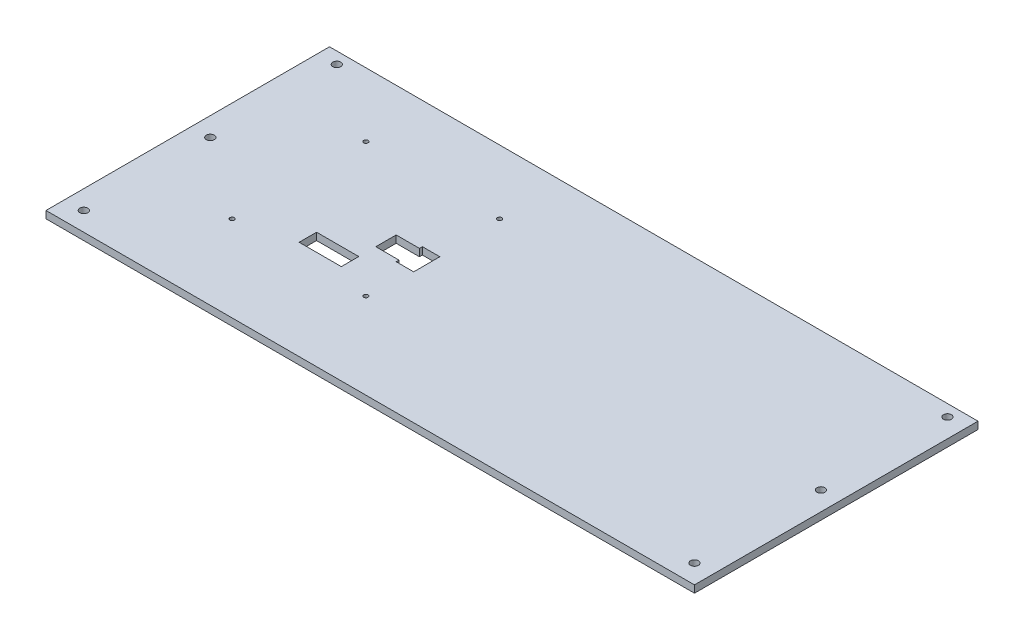
ISO-10303-21;
HEADER;
FILE_DESCRIPTION(('STEP AP214'),'2;1');
FILE_NAME('part.step','',(''),(''),'','','');
FILE_SCHEMA(('AUTOMOTIVE_DESIGN { 1 0 10303 214 1 1 1 1 }'));
ENDSEC;
DATA;
#1=APPLICATION_CONTEXT('core data for automotive mechanical design processes');
#2=APPLICATION_PROTOCOL_DEFINITION('international standard','automotive_design',2000,#1);
#3=PRODUCT_CONTEXT('',#1,'mechanical');
#4=PRODUCT('Part','Part','',(#3));
#5=PRODUCT_RELATED_PRODUCT_CATEGORY('part','',(#4));
#6=PRODUCT_DEFINITION_FORMATION('','',#4);
#7=PRODUCT_DEFINITION_CONTEXT('part definition',#1,'design');
#8=PRODUCT_DEFINITION('design','',#6,#7);
#9=PRODUCT_DEFINITION_SHAPE('','',#8);
#10=(LENGTH_UNIT() NAMED_UNIT(*) SI_UNIT(.MILLI.,.METRE.));
#11=(NAMED_UNIT(*) PLANE_ANGLE_UNIT() SI_UNIT($,.RADIAN.));
#12=(NAMED_UNIT(*) SI_UNIT($,.STERADIAN.) SOLID_ANGLE_UNIT());
#13=UNCERTAINTY_MEASURE_WITH_UNIT(LENGTH_MEASURE(1.E-05),#10,'distance_accuracy_value','');
#14=(GEOMETRIC_REPRESENTATION_CONTEXT(3) GLOBAL_UNCERTAINTY_ASSIGNED_CONTEXT((#13)) GLOBAL_UNIT_ASSIGNED_CONTEXT((#10,
#11,#12)) REPRESENTATION_CONTEXT('',''));
#15=CARTESIAN_POINT('',(0.,0.,0.));
#16=DIRECTION('',(0.,0.,1.));
#17=DIRECTION('',(1.,0.,0.));
#18=AXIS2_PLACEMENT_3D('',#15,#16,#17);
#19=CARTESIAN_POINT('',(0.,5.,0.));
#20=DIRECTION('',(0.,-1.,0.));
#21=DIRECTION('',(0.,0.,-1.));
#22=AXIS2_PLACEMENT_3D('',#19,#20,#21);
#23=PLANE('',#22);
#24=CARTESIAN_POINT('',(210.,5.,84.5));
#25=DIRECTION('',(0.,-1.,0.));
#26=DIRECTION('',(0.,0.,-1.));
#27=AXIS2_PLACEMENT_3D('',#24,#25,#26);
#28=CIRCLE('',#27,2.75);
#29=CARTESIAN_POINT('',(210.,5.,81.75));
#30=VERTEX_POINT('',#29);
#31=EDGE_CURVE('E578',#30,#30,#28,.T.);
#32=ORIENTED_EDGE('',*,*,#31,.T.);
#33=EDGE_LOOP('',(#32));
#34=FACE_BOUND('',#33,.T.);
#35=CARTESIAN_POINT('',(210.,5.,-2.5));
#36=DIRECTION('',(0.,-1.,0.));
#37=DIRECTION('',(0.,0.,-1.));
#38=AXIS2_PLACEMENT_3D('',#35,#36,#37);
#39=CIRCLE('',#38,2.75);
#40=CARTESIAN_POINT('',(210.,5.,-5.25));
#41=VERTEX_POINT('',#40);
#42=EDGE_CURVE('E645',#41,#41,#39,.T.);
#43=ORIENTED_EDGE('',*,*,#42,.T.);
#44=EDGE_LOOP('',(#43));
#45=FACE_BOUND('',#44,.T.);
#46=CARTESIAN_POINT('',(210.,5.,-89.5));
#47=DIRECTION('',(0.,-1.,0.));
#48=DIRECTION('',(0.,0.,-1.));
#49=AXIS2_PLACEMENT_3D('',#46,#47,#48);
#50=CIRCLE('',#49,2.75);
#51=CARTESIAN_POINT('',(210.,5.,-92.25));
#52=VERTEX_POINT('',#51);
#53=EDGE_CURVE('E639',#52,#52,#50,.T.);
#54=ORIENTED_EDGE('',*,*,#53,.T.);
#55=EDGE_LOOP('',(#54));
#56=FACE_BOUND('',#55,.T.);
#57=CARTESIAN_POINT('',(-210.,5.,-89.5));
#58=DIRECTION('',(0.,-1.,0.));
#59=DIRECTION('',(0.,0.,-1.));
#60=AXIS2_PLACEMENT_3D('',#57,#58,#59);
#61=CIRCLE('',#60,2.75);
#62=CARTESIAN_POINT('',(-210.,5.,-92.25));
#63=VERTEX_POINT('',#62);
#64=EDGE_CURVE('E631',#63,#63,#61,.T.);
#65=ORIENTED_EDGE('',*,*,#64,.T.);
#66=EDGE_LOOP('',(#65));
#67=FACE_BOUND('',#66,.T.);
#68=CARTESIAN_POINT('',(-210.,5.,-2.5));
#69=DIRECTION('',(0.,-1.,0.));
#70=DIRECTION('',(0.,0.,-1.));
#71=AXIS2_PLACEMENT_3D('',#68,#69,#70);
#72=CIRCLE('',#71,2.75);
#73=CARTESIAN_POINT('',(-210.,5.,-5.25));
#74=VERTEX_POINT('',#73);
#75=EDGE_CURVE('E594',#74,#74,#72,.T.);
#76=ORIENTED_EDGE('',*,*,#75,.T.);
#77=EDGE_LOOP('',(#76));
#78=FACE_BOUND('',#77,.T.);
#79=CARTESIAN_POINT('',(-210.,5.,84.5));
#80=DIRECTION('',(0.,-1.,0.));
#81=DIRECTION('',(0.,0.,-1.));
#82=AXIS2_PLACEMENT_3D('',#79,#80,#81);
#83=CIRCLE('',#82,2.75);
#84=CARTESIAN_POINT('',(-210.,5.,81.75));
#85=VERTEX_POINT('',#84);
#86=EDGE_CURVE('E587',#85,#85,#83,.T.);
#87=ORIENTED_EDGE('',*,*,#86,.T.);
#88=EDGE_LOOP('',(#87));
#89=FACE_BOUND('',#88,.T.);
#90=CARTESIAN_POINT('',(-154.,5.,38.5));
#91=DIRECTION('',(0.,1.,0.));
#92=DIRECTION('',(0.,0.,1.));
#93=AXIS2_PLACEMENT_3D('',#90,#91,#92);
#94=CIRCLE('',#93,1.5);
#95=CARTESIAN_POINT('',(-154.,5.,40.));
#96=VERTEX_POINT('',#95);
#97=EDGE_CURVE('E590',#96,#96,#94,.T.);
#98=ORIENTED_EDGE('',*,*,#97,.F.);
#99=EDGE_LOOP('',(#98));
#100=FACE_BOUND('',#99,.T.);
#101=CARTESIAN_POINT('',(-62.,5.,38.5));
#102=DIRECTION('',(0.,1.,0.));
#103=DIRECTION('',(0.,0.,1.));
#104=AXIS2_PLACEMENT_3D('',#101,#102,#103);
#105=CIRCLE('',#104,1.5);
#106=CARTESIAN_POINT('',(-62.,5.,40.));
#107=VERTEX_POINT('',#106);
#108=EDGE_CURVE('E598',#107,#107,#105,.T.);
#109=ORIENTED_EDGE('',*,*,#108,.F.);
#110=EDGE_LOOP('',(#109));
#111=FACE_BOUND('',#110,.T.);
#112=CARTESIAN_POINT('',(-62.,5.,-53.5));
#113=DIRECTION('',(0.,1.,0.));
#114=DIRECTION('',(0.,0.,1.));
#115=AXIS2_PLACEMENT_3D('',#112,#113,#114);
#116=CIRCLE('',#115,1.5);
#117=CARTESIAN_POINT('',(-62.,5.,-52.));
#118=VERTEX_POINT('',#117);
#119=EDGE_CURVE('E595',#118,#118,#116,.T.);
#120=ORIENTED_EDGE('',*,*,#119,.F.);
#121=EDGE_LOOP('',(#120));
#122=FACE_BOUND('',#121,.T.);
#123=CARTESIAN_POINT('',(-154.,5.,-53.5));
#124=DIRECTION('',(0.,1.,0.));
#125=DIRECTION('',(0.,0.,1.));
#126=AXIS2_PLACEMENT_3D('',#123,#124,#125);
#127=CIRCLE('',#126,1.5);
#128=CARTESIAN_POINT('',(-154.,5.,-52.));
#129=VERTEX_POINT('',#128);
#130=EDGE_CURVE('E258',#129,#129,#127,.T.);
#131=ORIENTED_EDGE('',*,*,#130,.F.);
#132=EDGE_LOOP('',(#131));
#133=FACE_BOUND('',#132,.T.);
#134=DIRECTION('',(0.,0.,-1.));
#135=VECTOR('',#134,1.);
#136=CARTESIAN_POINT('',(-88.,5.,17.3992734948907));
#137=LINE('',#136,#135);
#138=CARTESIAN_POINT('',(-88.,5.,29.3992734948907));
#139=VERTEX_POINT('',#138);
#140=CARTESIAN_POINT('',(-88.,5.,17.3992734948907));
#141=VERTEX_POINT('',#140);
#142=EDGE_CURVE('E198',#139,#141,#137,.T.);
#143=ORIENTED_EDGE('',*,*,#142,.F.);
#144=DIRECTION('',(1.,0.,0.));
#145=VECTOR('',#144,1.);
#146=CARTESIAN_POINT('',(-88.,5.,29.3992734948907));
#147=LINE('',#146,#145);
#148=CARTESIAN_POINT('',(-117.,5.,29.3992734948907));
#149=VERTEX_POINT('',#148);
#150=EDGE_CURVE('E206',#149,#139,#147,.T.);
#151=ORIENTED_EDGE('',*,*,#150,.F.);
#152=DIRECTION('',(0.,0.,1.));
#153=VECTOR('',#152,1.);
#154=CARTESIAN_POINT('',(-117.,5.,29.3992734948907));
#155=LINE('',#154,#153);
#156=CARTESIAN_POINT('',(-117.,5.,17.3992734948907));
#157=VERTEX_POINT('',#156);
#158=EDGE_CURVE('E203',#157,#149,#155,.T.);
#159=ORIENTED_EDGE('',*,*,#158,.F.);
#160=DIRECTION('',(-1.,0.,0.));
#161=VECTOR('',#160,1.);
#162=CARTESIAN_POINT('',(-117.,5.,17.3992734948907));
#163=LINE('',#162,#161);
#164=EDGE_CURVE('E200',#141,#157,#163,.T.);
#165=ORIENTED_EDGE('',*,*,#164,.F.);
#166=EDGE_LOOP('',(#143,#151,#159,#165));
#167=FACE_BOUND('',#166,.T.);
#168=DIRECTION('',(0.,0.,1.));
#169=VECTOR('',#168,1.);
#170=CARTESIAN_POINT('',(-223.,5.,-97.5));
#171=LINE('',#170,#169);
#172=CARTESIAN_POINT('',(-223.,5.,-97.5));
#173=VERTEX_POINT('',#172);
#174=CARTESIAN_POINT('',(-223.,5.,97.5));
#175=VERTEX_POINT('',#174);
#176=EDGE_CURVE('E229',#173,#175,#171,.T.);
#177=ORIENTED_EDGE('',*,*,#176,.T.);
#178=DIRECTION('',(1.,0.,0.));
#179=VECTOR('',#178,1.);
#180=CARTESIAN_POINT('',(223.,5.,97.5));
#181=LINE('',#180,#179);
#182=CARTESIAN_POINT('',(223.,5.,97.5));
#183=VERTEX_POINT('',#182);
#184=EDGE_CURVE('E232',#175,#183,#181,.T.);
#185=ORIENTED_EDGE('',*,*,#184,.T.);
#186=DIRECTION('',(0.,0.,-1.));
#187=VECTOR('',#186,1.);
#188=CARTESIAN_POINT('',(223.,5.,-97.5));
#189=LINE('',#188,#187);
#190=CARTESIAN_POINT('',(223.,5.,-97.5));
#191=VERTEX_POINT('',#190);
#192=EDGE_CURVE('E235',#183,#191,#189,.T.);
#193=ORIENTED_EDGE('',*,*,#192,.T.);
#194=DIRECTION('',(-1.,0.,0.));
#195=VECTOR('',#194,1.);
#196=CARTESIAN_POINT('',(223.,5.,-97.5));
#197=LINE('',#196,#195);
#198=EDGE_CURVE('E237',#191,#173,#197,.T.);
#199=ORIENTED_EDGE('',*,*,#198,.T.);
#200=EDGE_LOOP('',(#177,#185,#193,#199));
#201=FACE_BOUND('',#200,.T.);
#202=DIRECTION('',(0.,0.,1.));
#203=VECTOR('',#202,1.);
#204=CARTESIAN_POINT('',(-88.,5.,5.66987990452362));
#205=LINE('',#204,#203);
#206=CARTESIAN_POINT('',(-88.,5.,-8.33012009547638));
#207=VERTEX_POINT('',#206);
#208=CARTESIAN_POINT('',(-88.,5.,5.66987990452362));
#209=VERTEX_POINT('',#208);
#210=EDGE_CURVE('E132',#207,#209,#205,.T.);
#211=ORIENTED_EDGE('',*,*,#210,.F.);
#212=DIRECTION('',(-1.,0.,0.));
#213=VECTOR('',#212,1.);
#214=CARTESIAN_POINT('',(-88.,5.,-8.33012009547638));
#215=LINE('',#214,#213);
#216=CARTESIAN_POINT('',(-72.,5.,-8.33012009547638));
#217=VERTEX_POINT('',#216);
#218=EDGE_CURVE('E166',#217,#207,#215,.T.);
#219=ORIENTED_EDGE('',*,*,#218,.F.);
#220=DIRECTION('',(0.,0.,1.));
#221=VECTOR('',#220,1.);
#222=CARTESIAN_POINT('',(-72.,5.,-8.33012009547638));
#223=LINE('',#222,#221);
#224=CARTESIAN_POINT('',(-72.,5.,-10.3694505337534));
#225=VERTEX_POINT('',#224);
#226=EDGE_CURVE('E164',#225,#217,#223,.T.);
#227=ORIENTED_EDGE('',*,*,#226,.F.);
#228=DIRECTION('',(-1.,0.,0.));
#229=VECTOR('',#228,1.);
#230=CARTESIAN_POINT('',(-60.,5.,-10.3694505337534));
#231=LINE('',#230,#229);
#232=CARTESIAN_POINT('',(-60.,5.,-10.3694505337534));
#233=VERTEX_POINT('',#232);
#234=EDGE_CURVE('E162',#233,#225,#231,.T.);
#235=ORIENTED_EDGE('',*,*,#234,.F.);
#236=DIRECTION('',(0.,0.,-1.));
#237=VECTOR('',#236,1.);
#238=CARTESIAN_POINT('',(-60.,5.,7.63054946624664));
#239=LINE('',#238,#237);
#240=CARTESIAN_POINT('',(-60.,5.,7.63054946624664));
#241=VERTEX_POINT('',#240);
#242=EDGE_CURVE('E160',#241,#233,#239,.T.);
#243=ORIENTED_EDGE('',*,*,#242,.F.);
#244=DIRECTION('',(1.,0.,0.));
#245=VECTOR('',#244,1.);
#246=CARTESIAN_POINT('',(-60.,5.,7.63054946624664));
#247=LINE('',#246,#245);
#248=CARTESIAN_POINT('',(-72.,5.,7.63054946624664));
#249=VERTEX_POINT('',#248);
#250=EDGE_CURVE('E155',#249,#241,#247,.T.);
#251=ORIENTED_EDGE('',*,*,#250,.F.);
#252=DIRECTION('',(0.,0.,1.));
#253=VECTOR('',#252,1.);
#254=CARTESIAN_POINT('',(-72.,5.,7.63054946624664));
#255=LINE('',#254,#253);
#256=CARTESIAN_POINT('',(-72.,5.,5.66987990452362));
#257=VERTEX_POINT('',#256);
#258=EDGE_CURVE('E153',#257,#249,#255,.T.);
#259=ORIENTED_EDGE('',*,*,#258,.F.);
#260=DIRECTION('',(1.,0.,0.));
#261=VECTOR('',#260,1.);
#262=CARTESIAN_POINT('',(-88.,5.,5.66987990452362));
#263=LINE('',#262,#261);
#264=EDGE_CURVE('E140',#209,#257,#263,.T.);
#265=ORIENTED_EDGE('',*,*,#264,.F.);
#266=EDGE_LOOP('',(#211,#219,#227,#235,#243,#251,#259,#265));
#267=FACE_BOUND('',#266,.T.);
#268=ADVANCED_FACE('F17',(#34,#45,#56,#67,#78,#89,#100,#111,#122,#133,#167,#201,#267),#23,.F.);
#269=CARTESIAN_POINT('',(0.,0.,0.));
#270=DIRECTION('',(0.,-1.,0.));
#271=DIRECTION('',(0.,0.,-1.));
#272=AXIS2_PLACEMENT_3D('',#269,#270,#271);
#273=PLANE('',#272);
#274=CARTESIAN_POINT('',(210.,0.,84.5));
#275=DIRECTION('',(0.,-1.,0.));
#276=DIRECTION('',(0.,0.,-1.));
#277=AXIS2_PLACEMENT_3D('',#274,#275,#276);
#278=CIRCLE('',#277,2.75);
#279=CARTESIAN_POINT('',(210.,0.,81.75));
#280=VERTEX_POINT('',#279);
#281=EDGE_CURVE('E581',#280,#280,#278,.T.);
#282=ORIENTED_EDGE('',*,*,#281,.F.);
#283=EDGE_LOOP('',(#282));
#284=FACE_BOUND('',#283,.T.);
#285=CARTESIAN_POINT('',(210.,0.,-2.5));
#286=DIRECTION('',(0.,-1.,0.));
#287=DIRECTION('',(0.,0.,-1.));
#288=AXIS2_PLACEMENT_3D('',#285,#286,#287);
#289=CIRCLE('',#288,2.75);
#290=CARTESIAN_POINT('',(210.,0.,-5.25));
#291=VERTEX_POINT('',#290);
#292=EDGE_CURVE('E583',#291,#291,#289,.T.);
#293=ORIENTED_EDGE('',*,*,#292,.F.);
#294=EDGE_LOOP('',(#293));
#295=FACE_BOUND('',#294,.T.);
#296=CARTESIAN_POINT('',(210.,0.,-89.5));
#297=DIRECTION('',(0.,-1.,0.));
#298=DIRECTION('',(0.,0.,-1.));
#299=AXIS2_PLACEMENT_3D('',#296,#297,#298);
#300=CIRCLE('',#299,2.75);
#301=CARTESIAN_POINT('',(210.,0.,-92.25));
#302=VERTEX_POINT('',#301);
#303=EDGE_CURVE('E642',#302,#302,#300,.T.);
#304=ORIENTED_EDGE('',*,*,#303,.F.);
#305=EDGE_LOOP('',(#304));
#306=FACE_BOUND('',#305,.T.);
#307=CARTESIAN_POINT('',(-210.,0.,-89.5));
#308=DIRECTION('',(0.,-1.,0.));
#309=DIRECTION('',(0.,0.,-1.));
#310=AXIS2_PLACEMENT_3D('',#307,#308,#309);
#311=CIRCLE('',#310,2.75);
#312=CARTESIAN_POINT('',(-210.,0.,-92.25));
#313=VERTEX_POINT('',#312);
#314=EDGE_CURVE('E636',#313,#313,#311,.T.);
#315=ORIENTED_EDGE('',*,*,#314,.F.);
#316=EDGE_LOOP('',(#315));
#317=FACE_BOUND('',#316,.T.);
#318=CARTESIAN_POINT('',(-210.,0.,-2.5));
#319=DIRECTION('',(0.,-1.,0.));
#320=DIRECTION('',(0.,0.,-1.));
#321=AXIS2_PLACEMENT_3D('',#318,#319,#320);
#322=CIRCLE('',#321,2.75);
#323=CARTESIAN_POINT('',(-210.,0.,-5.25));
#324=VERTEX_POINT('',#323);
#325=EDGE_CURVE('E626',#324,#324,#322,.T.);
#326=ORIENTED_EDGE('',*,*,#325,.F.);
#327=EDGE_LOOP('',(#326));
#328=FACE_BOUND('',#327,.T.);
#329=CARTESIAN_POINT('',(-210.,0.,84.5));
#330=DIRECTION('',(0.,-1.,0.));
#331=DIRECTION('',(0.,0.,-1.));
#332=AXIS2_PLACEMENT_3D('',#329,#330,#331);
#333=CIRCLE('',#332,2.75);
#334=CARTESIAN_POINT('',(-210.,0.,81.75));
#335=VERTEX_POINT('',#334);
#336=EDGE_CURVE('E591',#335,#335,#333,.T.);
#337=ORIENTED_EDGE('',*,*,#336,.F.);
#338=EDGE_LOOP('',(#337));
#339=FACE_BOUND('',#338,.T.);
#340=CARTESIAN_POINT('',(-154.,0.,38.5));
#341=DIRECTION('',(0.,-1.,0.));
#342=DIRECTION('',(0.,0.,-1.));
#343=AXIS2_PLACEMENT_3D('',#340,#341,#342);
#344=CIRCLE('',#343,1.5);
#345=CARTESIAN_POINT('',(-154.,0.,37.));
#346=VERTEX_POINT('',#345);
#347=EDGE_CURVE('E21',#346,#346,#344,.T.);
#348=ORIENTED_EDGE('',*,*,#347,.F.);
#349=EDGE_LOOP('',(#348));
#350=FACE_BOUND('',#349,.T.);
#351=CARTESIAN_POINT('',(-62.,0.,38.5));
#352=DIRECTION('',(0.,-1.,0.));
#353=DIRECTION('',(0.,0.,-1.));
#354=AXIS2_PLACEMENT_3D('',#351,#352,#353);
#355=CIRCLE('',#354,1.5);
#356=CARTESIAN_POINT('',(-62.,0.,37.));
#357=VERTEX_POINT('',#356);
#358=EDGE_CURVE('E260',#357,#357,#355,.T.);
#359=ORIENTED_EDGE('',*,*,#358,.F.);
#360=EDGE_LOOP('',(#359));
#361=FACE_BOUND('',#360,.T.);
#362=CARTESIAN_POINT('',(-62.,0.,-53.5));
#363=DIRECTION('',(0.,-1.,0.));
#364=DIRECTION('',(0.,0.,-1.));
#365=AXIS2_PLACEMENT_3D('',#362,#363,#364);
#366=CIRCLE('',#365,1.5);
#367=CARTESIAN_POINT('',(-62.,0.,-55.));
#368=VERTEX_POINT('',#367);
#369=EDGE_CURVE('E257',#368,#368,#366,.T.);
#370=ORIENTED_EDGE('',*,*,#369,.F.);
#371=EDGE_LOOP('',(#370));
#372=FACE_BOUND('',#371,.T.);
#373=CARTESIAN_POINT('',(-154.,0.,-53.5));
#374=DIRECTION('',(0.,-1.,0.));
#375=DIRECTION('',(0.,0.,-1.));
#376=AXIS2_PLACEMENT_3D('',#373,#374,#375);
#377=CIRCLE('',#376,1.5);
#378=CARTESIAN_POINT('',(-154.,0.,-55.));
#379=VERTEX_POINT('',#378);
#380=EDGE_CURVE('E254',#379,#379,#377,.T.);
#381=ORIENTED_EDGE('',*,*,#380,.F.);
#382=EDGE_LOOP('',(#381));
#383=FACE_BOUND('',#382,.T.);
#384=DIRECTION('',(0.,0.,1.));
#385=VECTOR('',#384,1.);
#386=CARTESIAN_POINT('',(-223.,0.,-97.5));
#387=LINE('',#386,#385);
#388=CARTESIAN_POINT('',(-223.,0.,-97.5));
#389=VERTEX_POINT('',#388);
#390=CARTESIAN_POINT('',(-223.,0.,97.5));
#391=VERTEX_POINT('',#390);
#392=EDGE_CURVE('E228',#389,#391,#387,.T.);
#393=ORIENTED_EDGE('',*,*,#392,.F.);
#394=DIRECTION('',(-1.,0.,0.));
#395=VECTOR('',#394,1.);
#396=CARTESIAN_POINT('',(223.,0.,-97.5));
#397=LINE('',#396,#395);
#398=CARTESIAN_POINT('',(223.,0.,-97.5));
#399=VERTEX_POINT('',#398);
#400=EDGE_CURVE('E233',#399,#389,#397,.T.);
#401=ORIENTED_EDGE('',*,*,#400,.F.);
#402=DIRECTION('',(0.,0.,-1.));
#403=VECTOR('',#402,1.);
#404=CARTESIAN_POINT('',(223.,0.,-97.5));
#405=LINE('',#404,#403);
#406=CARTESIAN_POINT('',(223.,0.,97.5));
#407=VERTEX_POINT('',#406);
#408=EDGE_CURVE('E244',#407,#399,#405,.T.);
#409=ORIENTED_EDGE('',*,*,#408,.F.);
#410=DIRECTION('',(1.,0.,0.));
#411=VECTOR('',#410,1.);
#412=CARTESIAN_POINT('',(223.,0.,97.5));
#413=LINE('',#412,#411);
#414=EDGE_CURVE('E242',#391,#407,#413,.T.);
#415=ORIENTED_EDGE('',*,*,#414,.F.);
#416=EDGE_LOOP('',(#393,#401,#409,#415));
#417=FACE_BOUND('',#416,.T.);
#418=DIRECTION('',(1.,0.,0.));
#419=VECTOR('',#418,1.);
#420=CARTESIAN_POINT('',(-88.,0.,29.3992734948907));
#421=LINE('',#420,#419);
#422=CARTESIAN_POINT('',(-117.,0.,29.3992734948907));
#423=VERTEX_POINT('',#422);
#424=CARTESIAN_POINT('',(-88.,0.,29.3992734948907));
#425=VERTEX_POINT('',#424);
#426=EDGE_CURVE('E201',#423,#425,#421,.T.);
#427=ORIENTED_EDGE('',*,*,#426,.T.);
#428=DIRECTION('',(0.,0.,-1.));
#429=VECTOR('',#428,1.);
#430=CARTESIAN_POINT('',(-88.,0.,17.3992734948907));
#431=LINE('',#430,#429);
#432=CARTESIAN_POINT('',(-88.,0.,17.3992734948907));
#433=VERTEX_POINT('',#432);
#434=EDGE_CURVE('E148',#425,#433,#431,.T.);
#435=ORIENTED_EDGE('',*,*,#434,.T.);
#436=DIRECTION('',(-1.,0.,0.));
#437=VECTOR('',#436,1.);
#438=CARTESIAN_POINT('',(-117.,0.,17.3992734948907));
#439=LINE('',#438,#437);
#440=CARTESIAN_POINT('',(-117.,0.,17.3992734948907));
#441=VERTEX_POINT('',#440);
#442=EDGE_CURVE('E211',#433,#441,#439,.T.);
#443=ORIENTED_EDGE('',*,*,#442,.T.);
#444=DIRECTION('',(0.,0.,1.));
#445=VECTOR('',#444,1.);
#446=CARTESIAN_POINT('',(-117.,0.,29.3992734948907));
#447=LINE('',#446,#445);
#448=EDGE_CURVE('E214',#441,#423,#447,.T.);
#449=ORIENTED_EDGE('',*,*,#448,.T.);
#450=EDGE_LOOP('',(#427,#435,#443,#449));
#451=FACE_BOUND('',#450,.T.);
#452=DIRECTION('',(-1.,0.,0.));
#453=VECTOR('',#452,1.);
#454=CARTESIAN_POINT('',(-88.,0.,-8.33012009547638));
#455=LINE('',#454,#453);
#456=CARTESIAN_POINT('',(-72.,0.,-8.33012009547638));
#457=VERTEX_POINT('',#456);
#458=CARTESIAN_POINT('',(-88.,0.,-8.33012009547638));
#459=VERTEX_POINT('',#458);
#460=EDGE_CURVE('E141',#457,#459,#455,.T.);
#461=ORIENTED_EDGE('',*,*,#460,.T.);
#462=DIRECTION('',(0.,0.,1.));
#463=VECTOR('',#462,1.);
#464=CARTESIAN_POINT('',(-88.,0.,5.66987990452362));
#465=LINE('',#464,#463);
#466=CARTESIAN_POINT('',(-88.,0.,5.66987990452362));
#467=VERTEX_POINT('',#466);
#468=EDGE_CURVE('E42',#459,#467,#465,.T.);
#469=ORIENTED_EDGE('',*,*,#468,.T.);
#470=DIRECTION('',(1.,0.,0.));
#471=VECTOR('',#470,1.);
#472=CARTESIAN_POINT('',(-88.,0.,5.66987990452362));
#473=LINE('',#472,#471);
#474=CARTESIAN_POINT('',(-72.,0.,5.66987990452362));
#475=VERTEX_POINT('',#474);
#476=EDGE_CURVE('E147',#467,#475,#473,.T.);
#477=ORIENTED_EDGE('',*,*,#476,.T.);
#478=DIRECTION('',(0.,0.,1.));
#479=VECTOR('',#478,1.);
#480=CARTESIAN_POINT('',(-72.,0.,7.63054946624664));
#481=LINE('',#480,#479);
#482=CARTESIAN_POINT('',(-72.,0.,7.63054946624664));
#483=VERTEX_POINT('',#482);
#484=EDGE_CURVE('E170',#475,#483,#481,.T.);
#485=ORIENTED_EDGE('',*,*,#484,.T.);
#486=DIRECTION('',(1.,0.,0.));
#487=VECTOR('',#486,1.);
#488=CARTESIAN_POINT('',(-60.,0.,7.63054946624664));
#489=LINE('',#488,#487);
#490=CARTESIAN_POINT('',(-60.,0.,7.63054946624664));
#491=VERTEX_POINT('',#490);
#492=EDGE_CURVE('E173',#483,#491,#489,.T.);
#493=ORIENTED_EDGE('',*,*,#492,.T.);
#494=DIRECTION('',(0.,0.,-1.));
#495=VECTOR('',#494,1.);
#496=CARTESIAN_POINT('',(-60.,0.,7.63054946624664));
#497=LINE('',#496,#495);
#498=CARTESIAN_POINT('',(-60.,0.,-10.3694505337534));
#499=VERTEX_POINT('',#498);
#500=EDGE_CURVE('E176',#491,#499,#497,.T.);
#501=ORIENTED_EDGE('',*,*,#500,.T.);
#502=DIRECTION('',(-1.,0.,0.));
#503=VECTOR('',#502,1.);
#504=CARTESIAN_POINT('',(-60.,0.,-10.3694505337534));
#505=LINE('',#504,#503);
#506=CARTESIAN_POINT('',(-72.,0.,-10.3694505337534));
#507=VERTEX_POINT('',#506);
#508=EDGE_CURVE('E179',#499,#507,#505,.T.);
#509=ORIENTED_EDGE('',*,*,#508,.T.);
#510=DIRECTION('',(0.,0.,1.));
#511=VECTOR('',#510,1.);
#512=CARTESIAN_POINT('',(-72.,0.,-8.33012009547638));
#513=LINE('',#512,#511);
#514=EDGE_CURVE('E182',#507,#457,#513,.T.);
#515=ORIENTED_EDGE('',*,*,#514,.T.);
#516=EDGE_LOOP('',(#461,#469,#477,#485,#493,#501,#509,#515));
#517=FACE_BOUND('',#516,.T.);
#518=ADVANCED_FACE('F270',(#284,#295,#306,#317,#328,#339,#350,#361,#372,#383,#417,#451,#517),
#273,.T.);
#519=CARTESIAN_POINT('',(-223.,5.,-97.5));
#520=DIRECTION('',(1.,0.,0.));
#521=DIRECTION('',(0.,0.,-1.));
#522=AXIS2_PLACEMENT_3D('',#519,#520,#521);
#523=PLANE('',#522);
#524=ORIENTED_EDGE('',*,*,#392,.T.);
#525=DIRECTION('',(0.,-1.,0.));
#526=VECTOR('',#525,1.);
#527=CARTESIAN_POINT('',(-223.,5.,97.5));
#528=LINE('',#527,#526);
#529=EDGE_CURVE('E11',#175,#391,#528,.T.);
#530=ORIENTED_EDGE('',*,*,#529,.F.);
#531=ORIENTED_EDGE('',*,*,#176,.F.);
#532=DIRECTION('',(0.,-1.,0.));
#533=VECTOR('',#532,1.);
#534=CARTESIAN_POINT('',(-223.,5.,-97.5));
#535=LINE('',#534,#533);
#536=EDGE_CURVE('E239',#173,#389,#535,.T.);
#537=ORIENTED_EDGE('',*,*,#536,.T.);
#538=EDGE_LOOP('',(#524,#530,#531,#537));
#539=FACE_BOUND('',#538,.T.);
#540=ADVANCED_FACE('F19',(#539),#523,.F.);
#541=CARTESIAN_POINT('',(223.,5.,97.5));
#542=DIRECTION('',(0.,0.,-1.));
#543=DIRECTION('',(-1.,0.,0.));
#544=AXIS2_PLACEMENT_3D('',#541,#542,#543);
#545=PLANE('',#544);
#546=ORIENTED_EDGE('',*,*,#414,.T.);
#547=DIRECTION('',(0.,-1.,0.));
#548=VECTOR('',#547,1.);
#549=CARTESIAN_POINT('',(223.,5.,97.5));
#550=LINE('',#549,#548);
#551=EDGE_CURVE('E26',#183,#407,#550,.T.);
#552=ORIENTED_EDGE('',*,*,#551,.F.);
#553=ORIENTED_EDGE('',*,*,#184,.F.);
#554=ORIENTED_EDGE('',*,*,#529,.T.);
#555=EDGE_LOOP('',(#546,#552,#553,#554));
#556=FACE_BOUND('',#555,.T.);
#557=ADVANCED_FACE('F336',(#556),#545,.F.);
#558=CARTESIAN_POINT('',(223.,5.,-97.5));
#559=DIRECTION('',(-1.,0.,0.));
#560=DIRECTION('',(0.,0.,1.));
#561=AXIS2_PLACEMENT_3D('',#558,#559,#560);
#562=PLANE('',#561);
#563=ORIENTED_EDGE('',*,*,#408,.T.);
#564=DIRECTION('',(0.,-1.,0.));
#565=VECTOR('',#564,1.);
#566=CARTESIAN_POINT('',(223.,5.,-97.5));
#567=LINE('',#566,#565);
#568=EDGE_CURVE('E249',#191,#399,#567,.T.);
#569=ORIENTED_EDGE('',*,*,#568,.F.);
#570=ORIENTED_EDGE('',*,*,#192,.F.);
#571=ORIENTED_EDGE('',*,*,#551,.T.);
#572=EDGE_LOOP('',(#563,#569,#570,#571));
#573=FACE_BOUND('',#572,.T.);
#574=ADVANCED_FACE('F333',(#573),#562,.F.);
#575=CARTESIAN_POINT('',(223.,5.,-97.5));
#576=DIRECTION('',(0.,0.,1.));
#577=DIRECTION('',(1.,0.,0.));
#578=AXIS2_PLACEMENT_3D('',#575,#576,#577);
#579=PLANE('',#578);
#580=ORIENTED_EDGE('',*,*,#400,.T.);
#581=ORIENTED_EDGE('',*,*,#536,.F.);
#582=ORIENTED_EDGE('',*,*,#198,.F.);
#583=ORIENTED_EDGE('',*,*,#568,.T.);
#584=EDGE_LOOP('',(#580,#581,#582,#583));
#585=FACE_BOUND('',#584,.T.);
#586=ADVANCED_FACE('F330',(#585),#579,.F.);
#587=CARTESIAN_POINT('',(-88.,5.,17.3992734948907));
#588=DIRECTION('',(-1.,0.,0.));
#589=DIRECTION('',(0.,0.,1.));
#590=AXIS2_PLACEMENT_3D('',#587,#588,#589);
#591=PLANE('',#590);
#592=ORIENTED_EDGE('',*,*,#434,.F.);
#593=DIRECTION('',(0.,-1.,0.));
#594=VECTOR('',#593,1.);
#595=CARTESIAN_POINT('',(-88.,5.,29.3992734948907));
#596=LINE('',#595,#594);
#597=EDGE_CURVE('E208',#139,#425,#596,.T.);
#598=ORIENTED_EDGE('',*,*,#597,.F.);
#599=ORIENTED_EDGE('',*,*,#142,.T.);
#600=DIRECTION('',(0.,-1.,0.));
#601=VECTOR('',#600,1.);
#602=CARTESIAN_POINT('',(-88.,5.,17.3992734948907));
#603=LINE('',#602,#601);
#604=EDGE_CURVE('E225',#141,#433,#603,.T.);
#605=ORIENTED_EDGE('',*,*,#604,.T.);
#606=EDGE_LOOP('',(#592,#598,#599,#605));
#607=FACE_BOUND('',#606,.T.);
#608=ADVANCED_FACE('F327',(#607),#591,.T.);
#609=CARTESIAN_POINT('',(-117.,5.,17.3992734948907));
#610=DIRECTION('',(0.,0.,1.));
#611=DIRECTION('',(1.,0.,0.));
#612=AXIS2_PLACEMENT_3D('',#609,#610,#611);
#613=PLANE('',#612);
#614=ORIENTED_EDGE('',*,*,#442,.F.);
#615=ORIENTED_EDGE('',*,*,#604,.F.);
#616=ORIENTED_EDGE('',*,*,#164,.T.);
#617=DIRECTION('',(0.,-1.,0.));
#618=VECTOR('',#617,1.);
#619=CARTESIAN_POINT('',(-117.,5.,17.3992734948907));
#620=LINE('',#619,#618);
#621=EDGE_CURVE('E223',#157,#441,#620,.T.);
#622=ORIENTED_EDGE('',*,*,#621,.T.);
#623=EDGE_LOOP('',(#614,#615,#616,#622));
#624=FACE_BOUND('',#623,.T.);
#625=ADVANCED_FACE('F416',(#624),#613,.T.);
#626=CARTESIAN_POINT('',(-117.,5.,29.3992734948907));
#627=DIRECTION('',(1.,0.,0.));
#628=DIRECTION('',(0.,0.,-1.));
#629=AXIS2_PLACEMENT_3D('',#626,#627,#628);
#630=PLANE('',#629);
#631=ORIENTED_EDGE('',*,*,#448,.F.);
#632=ORIENTED_EDGE('',*,*,#621,.F.);
#633=ORIENTED_EDGE('',*,*,#158,.T.);
#634=DIRECTION('',(0.,-1.,0.));
#635=VECTOR('',#634,1.);
#636=CARTESIAN_POINT('',(-117.,5.,29.3992734948907));
#637=LINE('',#636,#635);
#638=EDGE_CURVE('E221',#149,#423,#637,.T.);
#639=ORIENTED_EDGE('',*,*,#638,.T.);
#640=EDGE_LOOP('',(#631,#632,#633,#639));
#641=FACE_BOUND('',#640,.T.);
#642=ADVANCED_FACE('F423',(#641),#630,.T.);
#643=CARTESIAN_POINT('',(-88.,5.,29.3992734948907));
#644=DIRECTION('',(0.,0.,-1.));
#645=DIRECTION('',(-1.,0.,0.));
#646=AXIS2_PLACEMENT_3D('',#643,#644,#645);
#647=PLANE('',#646);
#648=ORIENTED_EDGE('',*,*,#426,.F.);
#649=ORIENTED_EDGE('',*,*,#638,.F.);
#650=ORIENTED_EDGE('',*,*,#150,.T.);
#651=ORIENTED_EDGE('',*,*,#597,.T.);
#652=EDGE_LOOP('',(#648,#649,#650,#651));
#653=FACE_BOUND('',#652,.T.);
#654=ADVANCED_FACE('F431',(#653),#647,.T.);
#655=CARTESIAN_POINT('',(-88.,5.,5.66987990452362));
#656=DIRECTION('',(1.,0.,0.));
#657=DIRECTION('',(0.,0.,-1.));
#658=AXIS2_PLACEMENT_3D('',#655,#656,#657);
#659=PLANE('',#658);
#660=ORIENTED_EDGE('',*,*,#468,.F.);
#661=DIRECTION('',(0.,-1.,0.));
#662=VECTOR('',#661,1.);
#663=CARTESIAN_POINT('',(-88.,5.,-8.33012009547638));
#664=LINE('',#663,#662);
#665=EDGE_CURVE('E136',#207,#459,#664,.T.);
#666=ORIENTED_EDGE('',*,*,#665,.F.);
#667=ORIENTED_EDGE('',*,*,#210,.T.);
#668=DIRECTION('',(0.,-1.,0.));
#669=VECTOR('',#668,1.);
#670=CARTESIAN_POINT('',(-88.,5.,5.66987990452362));
#671=LINE('',#670,#669);
#672=EDGE_CURVE('E135',#209,#467,#671,.T.);
#673=ORIENTED_EDGE('',*,*,#672,.T.);
#674=EDGE_LOOP('',(#660,#666,#667,#673));
#675=FACE_BOUND('',#674,.T.);
#676=ADVANCED_FACE('F134',(#675),#659,.T.);
#677=CARTESIAN_POINT('',(-88.,5.,5.66987990452362));
#678=DIRECTION('',(0.,0.,-1.));
#679=DIRECTION('',(-1.,0.,0.));
#680=AXIS2_PLACEMENT_3D('',#677,#678,#679);
#681=PLANE('',#680);
#682=ORIENTED_EDGE('',*,*,#476,.F.);
#683=ORIENTED_EDGE('',*,*,#672,.F.);
#684=ORIENTED_EDGE('',*,*,#264,.T.);
#685=DIRECTION('',(0.,-1.,0.));
#686=VECTOR('',#685,1.);
#687=CARTESIAN_POINT('',(-72.,5.,5.66987990452362));
#688=LINE('',#687,#686);
#689=EDGE_CURVE('E149',#257,#475,#688,.T.);
#690=ORIENTED_EDGE('',*,*,#689,.T.);
#691=EDGE_LOOP('',(#682,#683,#684,#690));
#692=FACE_BOUND('',#691,.T.);
#693=ADVANCED_FACE('F144',(#692),#681,.T.);
#694=CARTESIAN_POINT('',(-72.,5.,7.63054946624664));
#695=DIRECTION('',(1.,0.,0.));
#696=DIRECTION('',(0.,0.,-1.));
#697=AXIS2_PLACEMENT_3D('',#694,#695,#696);
#698=PLANE('',#697);
#699=ORIENTED_EDGE('',*,*,#484,.F.);
#700=ORIENTED_EDGE('',*,*,#689,.F.);
#701=ORIENTED_EDGE('',*,*,#258,.T.);
#702=DIRECTION('',(0.,-1.,0.));
#703=VECTOR('',#702,1.);
#704=CARTESIAN_POINT('',(-72.,5.,7.63054946624664));
#705=LINE('',#704,#703);
#706=EDGE_CURVE('E195',#249,#483,#705,.T.);
#707=ORIENTED_EDGE('',*,*,#706,.T.);
#708=EDGE_LOOP('',(#699,#700,#701,#707));
#709=FACE_BOUND('',#708,.T.);
#710=ADVANCED_FACE('F307',(#709),#698,.T.);
#711=CARTESIAN_POINT('',(-60.,5.,7.63054946624664));
#712=DIRECTION('',(0.,0.,-1.));
#713=DIRECTION('',(-1.,0.,0.));
#714=AXIS2_PLACEMENT_3D('',#711,#712,#713);
#715=PLANE('',#714);
#716=ORIENTED_EDGE('',*,*,#492,.F.);
#717=ORIENTED_EDGE('',*,*,#706,.F.);
#718=ORIENTED_EDGE('',*,*,#250,.T.);
#719=DIRECTION('',(0.,-1.,0.));
#720=VECTOR('',#719,1.);
#721=CARTESIAN_POINT('',(-60.,5.,7.63054946624664));
#722=LINE('',#721,#720);
#723=EDGE_CURVE('E193',#241,#491,#722,.T.);
#724=ORIENTED_EDGE('',*,*,#723,.T.);
#725=EDGE_LOOP('',(#716,#717,#718,#724));
#726=FACE_BOUND('',#725,.T.);
#727=ADVANCED_FACE('F304',(#726),#715,.T.);
#728=CARTESIAN_POINT('',(-60.,5.,7.63054946624664));
#729=DIRECTION('',(-1.,0.,0.));
#730=DIRECTION('',(0.,0.,1.));
#731=AXIS2_PLACEMENT_3D('',#728,#729,#730);
#732=PLANE('',#731);
#733=ORIENTED_EDGE('',*,*,#500,.F.);
#734=ORIENTED_EDGE('',*,*,#723,.F.);
#735=ORIENTED_EDGE('',*,*,#242,.T.);
#736=DIRECTION('',(0.,-1.,0.));
#737=VECTOR('',#736,1.);
#738=CARTESIAN_POINT('',(-60.,5.,-10.3694505337534));
#739=LINE('',#738,#737);
#740=EDGE_CURVE('E191',#233,#499,#739,.T.);
#741=ORIENTED_EDGE('',*,*,#740,.T.);
#742=EDGE_LOOP('',(#733,#734,#735,#741));
#743=FACE_BOUND('',#742,.T.);
#744=ADVANCED_FACE('F299',(#743),#732,.T.);
#745=CARTESIAN_POINT('',(-60.,5.,-10.3694505337534));
#746=DIRECTION('',(0.,0.,1.));
#747=DIRECTION('',(1.,0.,0.));
#748=AXIS2_PLACEMENT_3D('',#745,#746,#747);
#749=PLANE('',#748);
#750=ORIENTED_EDGE('',*,*,#508,.F.);
#751=ORIENTED_EDGE('',*,*,#740,.F.);
#752=ORIENTED_EDGE('',*,*,#234,.T.);
#753=DIRECTION('',(0.,-1.,0.));
#754=VECTOR('',#753,1.);
#755=CARTESIAN_POINT('',(-72.,5.,-10.3694505337534));
#756=LINE('',#755,#754);
#757=EDGE_CURVE('E189',#225,#507,#756,.T.);
#758=ORIENTED_EDGE('',*,*,#757,.T.);
#759=EDGE_LOOP('',(#750,#751,#752,#758));
#760=FACE_BOUND('',#759,.T.);
#761=ADVANCED_FACE('F295',(#760),#749,.T.);
#762=CARTESIAN_POINT('',(-72.,5.,-8.33012009547638));
#763=DIRECTION('',(1.,0.,0.));
#764=DIRECTION('',(0.,0.,-1.));
#765=AXIS2_PLACEMENT_3D('',#762,#763,#764);
#766=PLANE('',#765);
#767=ORIENTED_EDGE('',*,*,#514,.F.);
#768=ORIENTED_EDGE('',*,*,#757,.F.);
#769=ORIENTED_EDGE('',*,*,#226,.T.);
#770=DIRECTION('',(0.,-1.,0.));
#771=VECTOR('',#770,1.);
#772=CARTESIAN_POINT('',(-72.,5.,-8.33012009547638));
#773=LINE('',#772,#771);
#774=EDGE_CURVE('E34',#217,#457,#773,.T.);
#775=ORIENTED_EDGE('',*,*,#774,.T.);
#776=EDGE_LOOP('',(#767,#768,#769,#775));
#777=FACE_BOUND('',#776,.T.);
#778=ADVANCED_FACE('F292',(#777),#766,.T.);
#779=CARTESIAN_POINT('',(-88.,5.,-8.33012009547638));
#780=DIRECTION('',(0.,0.,1.));
#781=DIRECTION('',(1.,0.,0.));
#782=AXIS2_PLACEMENT_3D('',#779,#780,#781);
#783=PLANE('',#782);
#784=ORIENTED_EDGE('',*,*,#460,.F.);
#785=ORIENTED_EDGE('',*,*,#774,.F.);
#786=ORIENTED_EDGE('',*,*,#218,.T.);
#787=ORIENTED_EDGE('',*,*,#665,.T.);
#788=EDGE_LOOP('',(#784,#785,#786,#787));
#789=FACE_BOUND('',#788,.T.);
#790=ADVANCED_FACE('F286',(#789),#783,.T.);
#791=CARTESIAN_POINT('',(-154.,-5.,-53.5));
#792=DIRECTION('',(0.,1.,0.));
#793=DIRECTION('',(0.,0.,1.));
#794=AXIS2_PLACEMENT_3D('',#791,#792,#793);
#795=CYLINDRICAL_SURFACE('',#794,1.5);
#796=ORIENTED_EDGE('',*,*,#380,.T.);
#797=EDGE_LOOP('',(#796));
#798=FACE_BOUND('',#797,.T.);
#799=ORIENTED_EDGE('',*,*,#130,.T.);
#800=EDGE_LOOP('',(#799));
#801=FACE_BOUND('',#800,.T.);
#802=ADVANCED_FACE('F476',(#798,#801),#795,.F.);
#803=CARTESIAN_POINT('',(-62.,-5.,-53.5));
#804=DIRECTION('',(0.,1.,0.));
#805=DIRECTION('',(0.,0.,1.));
#806=AXIS2_PLACEMENT_3D('',#803,#804,#805);
#807=CYLINDRICAL_SURFACE('',#806,1.5);
#808=ORIENTED_EDGE('',*,*,#369,.T.);
#809=EDGE_LOOP('',(#808));
#810=FACE_BOUND('',#809,.T.);
#811=ORIENTED_EDGE('',*,*,#119,.T.);
#812=EDGE_LOOP('',(#811));
#813=FACE_BOUND('',#812,.T.);
#814=ADVANCED_FACE('F485',(#810,#813),#807,.F.);
#815=CARTESIAN_POINT('',(-62.,-5.,38.5));
#816=DIRECTION('',(0.,1.,0.));
#817=DIRECTION('',(0.,0.,1.));
#818=AXIS2_PLACEMENT_3D('',#815,#816,#817);
#819=CYLINDRICAL_SURFACE('',#818,1.5);
#820=ORIENTED_EDGE('',*,*,#358,.T.);
#821=EDGE_LOOP('',(#820));
#822=FACE_BOUND('',#821,.T.);
#823=ORIENTED_EDGE('',*,*,#108,.T.);
#824=EDGE_LOOP('',(#823));
#825=FACE_BOUND('',#824,.T.);
#826=ADVANCED_FACE('F495',(#822,#825),#819,.F.);
#827=CARTESIAN_POINT('',(-154.,-5.,38.5));
#828=DIRECTION('',(0.,1.,0.));
#829=DIRECTION('',(0.,0.,1.));
#830=AXIS2_PLACEMENT_3D('',#827,#828,#829);
#831=CYLINDRICAL_SURFACE('',#830,1.5);
#832=ORIENTED_EDGE('',*,*,#347,.T.);
#833=EDGE_LOOP('',(#832));
#834=FACE_BOUND('',#833,.T.);
#835=ORIENTED_EDGE('',*,*,#97,.T.);
#836=EDGE_LOOP('',(#835));
#837=FACE_BOUND('',#836,.T.);
#838=ADVANCED_FACE('F267',(#834,#837),#831,.F.);
#839=CARTESIAN_POINT('',(-210.,5.,84.5));
#840=DIRECTION('',(0.,-1.,0.));
#841=DIRECTION('',(0.,0.,-1.));
#842=AXIS2_PLACEMENT_3D('',#839,#840,#841);
#843=CYLINDRICAL_SURFACE('',#842,2.75);
#844=ORIENTED_EDGE('',*,*,#86,.F.);
#845=EDGE_LOOP('',(#844));
#846=FACE_BOUND('',#845,.T.);
#847=ORIENTED_EDGE('',*,*,#336,.T.);
#848=EDGE_LOOP('',(#847));
#849=FACE_BOUND('',#848,.T.);
#850=ADVANCED_FACE('F513',(#846,#849),#843,.F.);
#851=CARTESIAN_POINT('',(-210.,5.,-2.5));
#852=DIRECTION('',(0.,-1.,0.));
#853=DIRECTION('',(0.,0.,-1.));
#854=AXIS2_PLACEMENT_3D('',#851,#852,#853);
#855=CYLINDRICAL_SURFACE('',#854,2.75);
#856=ORIENTED_EDGE('',*,*,#75,.F.);
#857=EDGE_LOOP('',(#856));
#858=FACE_BOUND('',#857,.T.);
#859=ORIENTED_EDGE('',*,*,#325,.T.);
#860=EDGE_LOOP('',(#859));
#861=FACE_BOUND('',#860,.T.);
#862=ADVANCED_FACE('F522',(#858,#861),#855,.F.);
#863=CARTESIAN_POINT('',(-210.,5.,-89.5));
#864=DIRECTION('',(0.,-1.,0.));
#865=DIRECTION('',(0.,0.,-1.));
#866=AXIS2_PLACEMENT_3D('',#863,#864,#865);
#867=CYLINDRICAL_SURFACE('',#866,2.75);
#868=ORIENTED_EDGE('',*,*,#64,.F.);
#869=EDGE_LOOP('',(#868));
#870=FACE_BOUND('',#869,.T.);
#871=ORIENTED_EDGE('',*,*,#314,.T.);
#872=EDGE_LOOP('',(#871));
#873=FACE_BOUND('',#872,.T.);
#874=ADVANCED_FACE('F532',(#870,#873),#867,.F.);
#875=CARTESIAN_POINT('',(210.,5.,-89.5));
#876=DIRECTION('',(0.,-1.,0.));
#877=DIRECTION('',(0.,0.,-1.));
#878=AXIS2_PLACEMENT_3D('',#875,#876,#877);
#879=CYLINDRICAL_SURFACE('',#878,2.75);
#880=ORIENTED_EDGE('',*,*,#53,.F.);
#881=EDGE_LOOP('',(#880));
#882=FACE_BOUND('',#881,.T.);
#883=ORIENTED_EDGE('',*,*,#303,.T.);
#884=EDGE_LOOP('',(#883));
#885=FACE_BOUND('',#884,.T.);
#886=ADVANCED_FACE('F542',(#882,#885),#879,.F.);
#887=CARTESIAN_POINT('',(210.,5.,-2.5));
#888=DIRECTION('',(0.,-1.,0.));
#889=DIRECTION('',(0.,0.,-1.));
#890=AXIS2_PLACEMENT_3D('',#887,#888,#889);
#891=CYLINDRICAL_SURFACE('',#890,2.75);
#892=ORIENTED_EDGE('',*,*,#42,.F.);
#893=EDGE_LOOP('',(#892));
#894=FACE_BOUND('',#893,.T.);
#895=ORIENTED_EDGE('',*,*,#292,.T.);
#896=EDGE_LOOP('',(#895));
#897=FACE_BOUND('',#896,.T.);
#898=ADVANCED_FACE('F552',(#894,#897),#891,.F.);
#899=CARTESIAN_POINT('',(210.,5.,84.5));
#900=DIRECTION('',(0.,-1.,0.));
#901=DIRECTION('',(0.,0.,-1.));
#902=AXIS2_PLACEMENT_3D('',#899,#900,#901);
#903=CYLINDRICAL_SURFACE('',#902,2.75);
#904=ORIENTED_EDGE('',*,*,#31,.F.);
#905=EDGE_LOOP('',(#904));
#906=FACE_BOUND('',#905,.T.);
#907=ORIENTED_EDGE('',*,*,#281,.T.);
#908=EDGE_LOOP('',(#907));
#909=FACE_BOUND('',#908,.T.);
#910=ADVANCED_FACE('F562',(#906,#909),#903,.F.);
#911=CLOSED_SHELL('',(#268,#518,#540,#557,#574,#586,#608,#625,#642,#654,#676,#693,#710,#727,
#744,#761,#778,#790,#802,#814,#826,#838,#850,#862,#874,#886,#898,#910));
#912=MANIFOLD_SOLID_BREP('B1',#911);
#913=ADVANCED_BREP_SHAPE_REPRESENTATION('',(#18,#912),#14);
#914=SHAPE_DEFINITION_REPRESENTATION(#9,#913);
ENDSEC;
END-ISO-10303-21;
